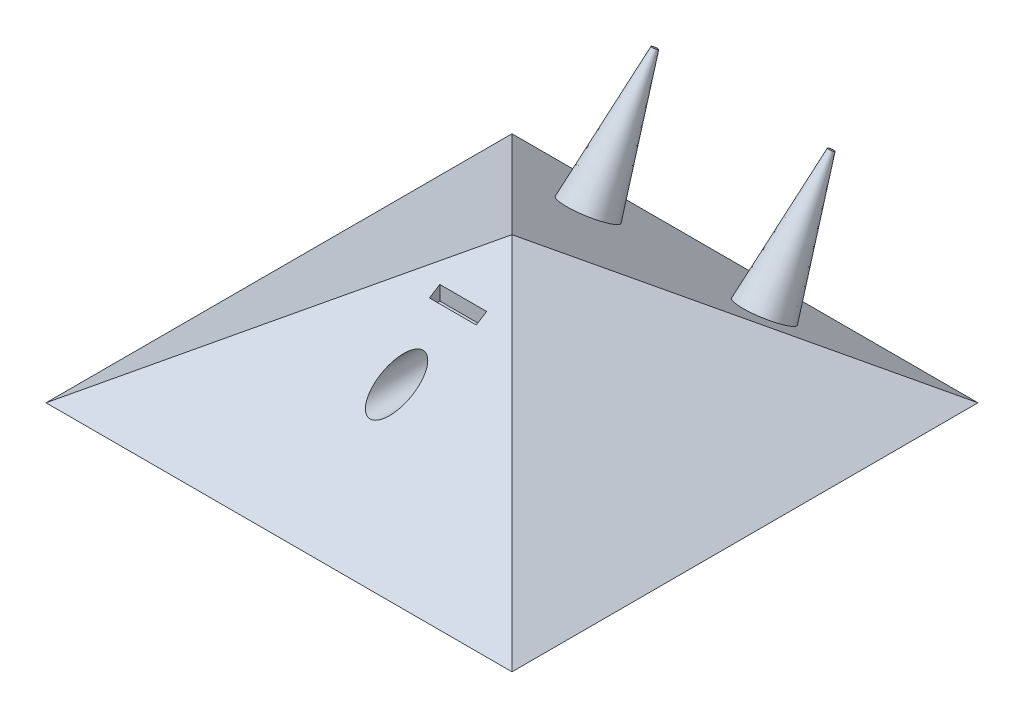
ISO-10303-21;
HEADER;
FILE_DESCRIPTION(('STEP AP214'),'2;1');
FILE_NAME('part.step','',(''),(''),'','','');
FILE_SCHEMA(('AUTOMOTIVE_DESIGN { 1 0 10303 214 1 1 1 1 }'));
ENDSEC;
DATA;
#1=APPLICATION_CONTEXT('core data for automotive mechanical design processes');
#2=APPLICATION_PROTOCOL_DEFINITION('international standard','automotive_design',2000,#1);
#3=PRODUCT_CONTEXT('',#1,'mechanical');
#4=PRODUCT('Part','Part','',(#3));
#5=PRODUCT_RELATED_PRODUCT_CATEGORY('part','',(#4));
#6=PRODUCT_DEFINITION_FORMATION('','',#4);
#7=PRODUCT_DEFINITION_CONTEXT('part definition',#1,'design');
#8=PRODUCT_DEFINITION('design','',#6,#7);
#9=PRODUCT_DEFINITION_SHAPE('','',#8);
#10=(LENGTH_UNIT() NAMED_UNIT(*) SI_UNIT(.MILLI.,.METRE.));
#11=(NAMED_UNIT(*) PLANE_ANGLE_UNIT() SI_UNIT($,.RADIAN.));
#12=(NAMED_UNIT(*) SI_UNIT($,.STERADIAN.) SOLID_ANGLE_UNIT());
#13=UNCERTAINTY_MEASURE_WITH_UNIT(LENGTH_MEASURE(1.E-05),#10,'distance_accuracy_value','');
#14=(GEOMETRIC_REPRESENTATION_CONTEXT(3) GLOBAL_UNCERTAINTY_ASSIGNED_CONTEXT((#13)) GLOBAL_UNIT_ASSIGNED_CONTEXT((#10,
#11,#12)) REPRESENTATION_CONTEXT('',''));
#15=CARTESIAN_POINT('',(0.,0.,0.));
#16=DIRECTION('',(0.,0.,1.));
#17=DIRECTION('',(1.,0.,0.));
#18=AXIS2_PLACEMENT_3D('',#15,#16,#17);
#19=CARTESIAN_POINT('',(-23.495,0.,-23.495));
#20=DIRECTION('',(0.,0.848048096156427,-0.529919264233203));
#21=DIRECTION('',(0.,0.529919264233203,0.848048096156427));
#22=AXIS2_PLACEMENT_3D('',#19,#20,#21);
#23=PLANE('',#22);
#24=CARTESIAN_POINT('',(9.43263957281454,4.66713960000683,-16.0260153462542));
#25=DIRECTION('',(0.,0.848048096156427,-0.529919264233203));
#26=DIRECTION('',(0.,0.529919264233203,0.848048096156427));
#27=AXIS2_PLACEMENT_3D('',#24,#25,#26);
#28=CIRCLE('',#27,2.54);
#29=CARTESIAN_POINT('',(9.43263957281454,6.01313453115917,-13.8719731820169));
#30=VERTEX_POINT('',#29);
#31=EDGE_CURVE('E141',#30,#30,#28,.T.);
#32=ORIENTED_EDGE('',*,*,#31,.F.);
#33=EDGE_LOOP('',(#32));
#34=FACE_BOUND('',#33,.T.);
#35=DIRECTION('',(-1.,0.,0.));
#36=VECTOR('',#35,1.);
#37=CARTESIAN_POINT('',(-23.495,0.,-23.495));
#38=LINE('',#37,#36);
#39=CARTESIAN_POINT('',(23.495,0.,-23.495));
#40=VERTEX_POINT('',#39);
#41=CARTESIAN_POINT('',(-23.495,0.,-23.495));
#42=VERTEX_POINT('',#41);
#43=EDGE_CURVE('E130',#40,#42,#38,.T.);
#44=ORIENTED_EDGE('',*,*,#43,.T.);
#45=DIRECTION('',(-0.646783756612922,-0.404155346820195,-0.646783756612922));
#46=VECTOR('',#45,1.);
#47=CARTESIAN_POINT('',(-3.83770958481696,12.2832383220288,-3.83770958481696));
#48=LINE('',#47,#46);
#49=CARTESIAN_POINT('',(0.,14.6813054231096,0.));
#50=VERTEX_POINT('',#49);
#51=EDGE_CURVE('E54',#50,#42,#48,.T.);
#52=ORIENTED_EDGE('',*,*,#51,.F.);
#53=DIRECTION('',(0.646783756612922,-0.404155346820195,-0.646783756612922));
#54=VECTOR('',#53,1.);
#55=CARTESIAN_POINT('',(3.83770958481695,12.2832383220288,-3.83770958481696));
#56=LINE('',#55,#54);
#57=EDGE_CURVE('E139',#50,#40,#56,.T.);
#58=ORIENTED_EDGE('',*,*,#57,.T.);
#59=EDGE_LOOP('',(#44,#52,#58));
#60=FACE_BOUND('',#59,.T.);
#61=CARTESIAN_POINT('',(-8.34736042718546,4.66713960000683,-16.0260153462542));
#62=DIRECTION('',(0.,0.848048096156427,-0.529919264233203));
#63=DIRECTION('',(0.,0.529919264233203,0.848048096156427));
#64=AXIS2_PLACEMENT_3D('',#61,#62,#63);
#65=CIRCLE('',#64,2.54);
#66=CARTESIAN_POINT('',(-8.34736042718546,6.01313453115917,-13.8719731820169));
#67=VERTEX_POINT('',#66);
#68=EDGE_CURVE('E148',#67,#67,#65,.T.);
#69=ORIENTED_EDGE('',*,*,#68,.F.);
#70=EDGE_LOOP('',(#69));
#71=FACE_BOUND('',#70,.T.);
#72=ADVANCED_FACE('F32',(#34,#60,#71),#23,.T.);
#73=CARTESIAN_POINT('',(23.495,0.,23.495));
#74=DIRECTION('',(0.529919264233203,0.848048096156427,0.));
#75=DIRECTION('',(-0.848048096156427,0.529919264233203,0.));
#76=AXIS2_PLACEMENT_3D('',#73,#74,#75);
#77=PLANE('',#76);
#78=DIRECTION('',(0.,0.,-1.));
#79=VECTOR('',#78,1.);
#80=CARTESIAN_POINT('',(23.495,0.,23.495));
#81=LINE('',#80,#79);
#82=CARTESIAN_POINT('',(23.495,0.,23.495));
#83=VERTEX_POINT('',#82);
#84=EDGE_CURVE('E127',#83,#40,#81,.T.);
#85=ORIENTED_EDGE('',*,*,#84,.T.);
#86=ORIENTED_EDGE('',*,*,#57,.F.);
#87=DIRECTION('',(0.646783756612922,-0.404155346820195,0.646783756612922));
#88=VECTOR('',#87,1.);
#89=CARTESIAN_POINT('',(23.495,0.,23.495));
#90=LINE('',#89,#88);
#91=EDGE_CURVE('E138',#50,#83,#90,.T.);
#92=ORIENTED_EDGE('',*,*,#91,.T.);
#93=EDGE_LOOP('',(#85,#86,#92));
#94=FACE_BOUND('',#93,.T.);
#95=ADVANCED_FACE('F174',(#94),#77,.T.);
#96=CARTESIAN_POINT('',(-23.495,0.,23.495));
#97=DIRECTION('',(-0.529919264233203,0.848048096156427,0.));
#98=DIRECTION('',(-0.848048096156427,-0.529919264233203,0.));
#99=AXIS2_PLACEMENT_3D('',#96,#97,#98);
#100=PLANE('',#99);
#101=DIRECTION('',(0.,0.,1.));
#102=VECTOR('',#101,1.);
#103=CARTESIAN_POINT('',(-23.495,0.,23.495));
#104=LINE('',#103,#102);
#105=CARTESIAN_POINT('',(-23.495,0.,23.495));
#106=VERTEX_POINT('',#105);
#107=EDGE_CURVE('E132',#42,#106,#104,.T.);
#108=ORIENTED_EDGE('',*,*,#107,.T.);
#109=DIRECTION('',(-0.646783756612922,-0.404155346820195,0.646783756612922));
#110=VECTOR('',#109,1.);
#111=CARTESIAN_POINT('',(-23.495,0.,23.495));
#112=LINE('',#111,#110);
#113=EDGE_CURVE('E143',#50,#106,#112,.T.);
#114=ORIENTED_EDGE('',*,*,#113,.F.);
#115=ORIENTED_EDGE('',*,*,#51,.T.);
#116=EDGE_LOOP('',(#108,#114,#115));
#117=FACE_BOUND('',#116,.T.);
#118=ADVANCED_FACE('F179',(#117),#100,.T.);
#119=CARTESIAN_POINT('',(-23.495,0.,23.495));
#120=DIRECTION('',(0.,0.848048096156427,0.529919264233203));
#121=DIRECTION('',(0.,-0.529919264233203,0.848048096156427));
#122=AXIS2_PLACEMENT_3D('',#119,#120,#121);
#123=PLANE('',#122);
#124=DIRECTION('',(-1.,0.,0.));
#125=VECTOR('',#124,1.);
#126=CARTESIAN_POINT('',(-23.495,11.6103817428291,4.91450520160276));
#127=LINE('',#126,#125);
#128=CARTESIAN_POINT('',(-2.36014350375294,11.6103817428291,4.91450520160276));
#129=VERTEX_POINT('',#128);
#130=CARTESIAN_POINT('',(2.36014350375294,11.6103817428291,4.91450520160276));
#131=VERTEX_POINT('',#130);
#132=EDGE_CURVE('E151',#129,#131,#127,.F.);
#133=ORIENTED_EDGE('',*,*,#132,.T.);
#134=DIRECTION('',(0.,0.529919264233203,-0.848048096156427));
#135=VECTOR('',#134,1.);
#136=CARTESIAN_POINT('',(2.36014350375294,0.,23.495));
#137=LINE('',#136,#135);
#138=CARTESIAN_POINT('',(2.36014350375294,10.9549233687832,5.96345786993739));
#139=VERTEX_POINT('',#138);
#140=EDGE_CURVE('E11',#131,#139,#137,.F.);
#141=ORIENTED_EDGE('',*,*,#140,.T.);
#142=DIRECTION('',(1.,0.,0.));
#143=VECTOR('',#142,1.);
#144=CARTESIAN_POINT('',(-23.495,10.9549233687832,5.96345786993739));
#145=LINE('',#144,#143);
#146=CARTESIAN_POINT('',(-2.36014350375294,10.9549233687832,5.96345786993739));
#147=VERTEX_POINT('',#146);
#148=EDGE_CURVE('E39',#139,#147,#145,.F.);
#149=ORIENTED_EDGE('',*,*,#148,.T.);
#150=DIRECTION('',(0.,-0.529919264233203,0.848048096156427));
#151=VECTOR('',#150,1.);
#152=CARTESIAN_POINT('',(-2.36014350375294,0.,23.495));
#153=LINE('',#152,#151);
#154=EDGE_CURVE('E155',#147,#129,#153,.F.);
#155=ORIENTED_EDGE('',*,*,#154,.T.);
#156=EDGE_LOOP('',(#133,#141,#149,#155));
#157=FACE_BOUND('',#156,.T.);
#158=CARTESIAN_POINT('',(0.,7.40791,11.6398658389715));
#159=DIRECTION('',(0.,0.848048096156427,0.529919264233203));
#160=DIRECTION('',(0.,-0.529919264233203,0.848048096156427));
#161=AXIS2_PLACEMENT_3D('',#158,#159,#160);
#162=ELLIPSE('',#161,3.14552633298203,1.666875);
#163=CARTESIAN_POINT('',(0.,5.741035,14.3074234570668));
#164=VERTEX_POINT('',#163);
#165=EDGE_CURVE('E120',#164,#164,#162,.F.);
#166=ORIENTED_EDGE('',*,*,#165,.T.);
#167=EDGE_LOOP('',(#166));
#168=FACE_BOUND('',#167,.T.);
#169=DIRECTION('',(1.,0.,0.));
#170=VECTOR('',#169,1.);
#171=CARTESIAN_POINT('',(-23.495,0.,23.495));
#172=LINE('',#171,#170);
#173=EDGE_CURVE('E135',#106,#83,#172,.T.);
#174=ORIENTED_EDGE('',*,*,#173,.T.);
#175=ORIENTED_EDGE('',*,*,#91,.F.);
#176=ORIENTED_EDGE('',*,*,#113,.T.);
#177=EDGE_LOOP('',(#174,#175,#176));
#178=FACE_BOUND('',#177,.T.);
#179=ADVANCED_FACE('F159',(#157,#168,#178),#123,.T.);
#180=CARTESIAN_POINT('',(0.,0.,0.));
#181=DIRECTION('',(0.,-1.,0.));
#182=DIRECTION('',(0.,0.,-1.));
#183=AXIS2_PLACEMENT_3D('',#180,#181,#182);
#184=PLANE('',#183);
#185=ORIENTED_EDGE('',*,*,#84,.F.);
#186=ORIENTED_EDGE('',*,*,#173,.F.);
#187=ORIENTED_EDGE('',*,*,#107,.F.);
#188=ORIENTED_EDGE('',*,*,#43,.F.);
#189=EDGE_LOOP('',(#185,#186,#187,#188));
#190=FACE_BOUND('',#189,.T.);
#191=ADVANCED_FACE('F208',(#190),#184,.T.);
#192=CARTESIAN_POINT('',(9.43263957281454,4.66713960000683,-16.0260153462542));
#193=DIRECTION('',(0.,-0.848048096156427,0.529919264233203));
#194=DIRECTION('',(0.,0.529919264233203,0.848048096156427));
#195=AXIS2_PLACEMENT_3D('',#192,#193,#194);
#196=CONICAL_SURFACE('',#195,2.54,0.174532925199433);
#197=CARTESIAN_POINT('',(9.43263957281454,15.4373504211935,-22.7559900020159));
#198=DIRECTION('',(0.,0.848048096156427,-0.529919264233203));
#199=DIRECTION('',(0.,0.529919264233203,0.848048096156427));
#200=AXIS2_PLACEMENT_3D('',#197,#198,#199);
#201=CIRCLE('',#200,0.300647345002491);
#202=CARTESIAN_POINT('',(9.43263957281454,15.5966692410508,-22.501026593472));
#203=VERTEX_POINT('',#202);
#204=EDGE_CURVE('E124',#203,#203,#201,.T.);
#205=CARTESIAN_POINT('',(9.43263957281454,15.5966692410508,-22.501026593472));
#206=CARTESIAN_POINT('',(9.43263957281454,15.4968407544895,-22.411140620436));
#207=CARTESIAN_POINT('',(9.43263957281454,15.3970122679281,-22.3212546474001));
#208=CARTESIAN_POINT('',(9.43263957281454,15.1973552948054,-22.1414827013281));
#209=CARTESIAN_POINT('',(9.43263957281454,15.097526808244,-22.0515967282921));
#210=CARTESIAN_POINT('',(9.43263957281454,14.8978698351212,-21.8718247822201));
#211=CARTESIAN_POINT('',(9.43263957281454,14.7980413485599,-21.7819388091841));
#212=CARTESIAN_POINT('',(9.43263957281454,14.5983843754371,-21.6021668631121));
#213=CARTESIAN_POINT('',(9.43263957281454,14.4985558888758,-21.5122808900761));
#214=CARTESIAN_POINT('',(9.43263957281454,14.298898915753,-21.3325089440042));
#215=CARTESIAN_POINT('',(9.43263957281454,14.1990704291916,-21.2426229709682));
#216=CARTESIAN_POINT('',(9.43263957281454,13.9994134560689,-21.0628510248962));
#217=CARTESIAN_POINT('',(9.43263957281454,13.8995849695075,-20.9729650518602));
#218=CARTESIAN_POINT('',(9.43263957281454,13.6999279963848,-20.7931931057882));
#219=CARTESIAN_POINT('',(9.43263957281454,13.6000995098234,-20.7033071327522));
#220=CARTESIAN_POINT('',(9.43263957281454,13.4004425367007,-20.5235351866802));
#221=CARTESIAN_POINT('',(9.43263957281454,13.3006140501393,-20.4336492136442));
#222=CARTESIAN_POINT('',(9.43263957281454,13.1009570770166,-20.2538772675723));
#223=CARTESIAN_POINT('',(9.43263957281454,13.0011285904552,-20.1639912945363));
#224=CARTESIAN_POINT('',(9.43263957281454,12.8014716173324,-19.9842193484643));
#225=CARTESIAN_POINT('',(9.43263957281454,12.7016431307711,-19.8943333754283));
#226=CARTESIAN_POINT('',(9.43263957281454,12.5019861576483,-19.7145614293563));
#227=CARTESIAN_POINT('',(9.43263957281454,12.402157671087,-19.6246754563203));
#228=CARTESIAN_POINT('',(9.43263957281454,12.2025006979642,-19.4449035102483));
#229=CARTESIAN_POINT('',(9.43263957281454,12.1026722114028,-19.3550175372123));
#230=CARTESIAN_POINT('',(9.43263957281454,11.9030152382801,-19.1752455911404));
#231=CARTESIAN_POINT('',(9.43263957281454,11.8031867517187,-19.0853596181044));
#232=CARTESIAN_POINT('',(9.43263957281454,11.603529778596,-18.9055876720324));
#233=CARTESIAN_POINT('',(9.43263957281454,11.5037012920346,-18.8157016989964));
#234=CARTESIAN_POINT('',(9.43263957281454,11.3040443189119,-18.6359297529244));
#235=CARTESIAN_POINT('',(9.43263957281454,11.2042158323505,-18.5460437798884));
#236=CARTESIAN_POINT('',(9.43263957281454,11.0045588592277,-18.3662718338164));
#237=CARTESIAN_POINT('',(9.43263957281454,10.9047303726664,-18.2763858607804));
#238=CARTESIAN_POINT('',(9.43263957281454,10.7050733995436,-18.0966139147085));
#239=CARTESIAN_POINT('',(9.43263957281454,10.6052449129823,-18.0067279416725));
#240=CARTESIAN_POINT('',(9.43263957281454,10.4055879398595,-17.8269559956005));
#241=CARTESIAN_POINT('',(9.43263957281454,10.3057594532981,-17.7370700225645));
#242=CARTESIAN_POINT('',(9.43263957281454,10.1061024801754,-17.5572980764925));
#243=CARTESIAN_POINT('',(9.43263957281454,10.006273993614,-17.4674121034565));
#244=CARTESIAN_POINT('',(9.43263957281454,9.80661702049129,-17.2876401573845));
#245=CARTESIAN_POINT('',(9.43263957281454,9.70678853392991,-17.1977541843486));
#246=CARTESIAN_POINT('',(9.43263957281454,9.50713156080717,-17.0179822382766));
#247=CARTESIAN_POINT('',(9.43263957281454,9.4073030742458,-16.9280962652406));
#248=CARTESIAN_POINT('',(9.43263957281454,9.20764610112306,-16.7483243191686));
#249=CARTESIAN_POINT('',(9.43263957281454,9.10781761456169,-16.6584383461326));
#250=CARTESIAN_POINT('',(9.43263957281454,8.90816064143894,-16.4786664000606));
#251=CARTESIAN_POINT('',(9.43263957281454,8.80833215487757,-16.3887804270246));
#252=CARTESIAN_POINT('',(9.43263957281454,8.60867518175483,-16.2090084809526));
#253=CARTESIAN_POINT('',(9.43263957281454,8.50884669519346,-16.1191225079167));
#254=CARTESIAN_POINT('',(9.43263957281454,8.30918972207071,-15.9393505618447));
#255=CARTESIAN_POINT('',(9.43263957281454,8.20936123550934,-15.8494645888087));
#256=CARTESIAN_POINT('',(9.43263957281454,8.0097042623866,-15.6696926427367));
#257=CARTESIAN_POINT('',(9.43263957281454,7.90987577582523,-15.5798066697007));
#258=CARTESIAN_POINT('',(9.43263957281454,7.71021880270248,-15.4000347236287));
#259=CARTESIAN_POINT('',(9.43263957281454,7.61039031614111,-15.3101487505927));
#260=CARTESIAN_POINT('',(9.43263957281454,7.41073334301837,-15.1303768045207));
#261=CARTESIAN_POINT('',(9.43263957281454,7.310904856457,-15.0404908314848));
#262=CARTESIAN_POINT('',(9.43263957281454,7.11124788333425,-14.8607188854128));
#263=CARTESIAN_POINT('',(9.43263957281454,7.01141939677288,-14.7708329123768));
#264=CARTESIAN_POINT('',(9.43263957281454,6.81176242365014,-14.5910609663048));
#265=CARTESIAN_POINT('',(9.43263957281454,6.71193393708877,-14.5011749932688));
#266=CARTESIAN_POINT('',(9.43263957281454,6.51227696396602,-14.3214030471968));
#267=CARTESIAN_POINT('',(9.43263957281454,6.41244847740465,-14.2315170741608));
#268=CARTESIAN_POINT('',(9.43263957281454,6.21279150428191,-14.0517451280889));
#269=CARTESIAN_POINT('',(9.43263957281454,6.11296301772054,-13.9618591550529));
#270=CARTESIAN_POINT('',(9.43263957281454,6.01313453115917,-13.8719731820169));
#271=B_SPLINE_CURVE_WITH_KNOTS('',3,(#205,#206,#207,#208,#209,#210,#211,#212,#213,#214,#215,
#216,#217,#218,#219,#220,#221,#222,#223,#224,#225,#226,#227,#228,#229,#230,#231,#232,#233,#234,
#235,#236,#237,#238,#239,#240,#241,#242,#243,#244,#245,#246,#247,#248,#249,#250,#251,#252,#253,
#254,#255,#256,#257,#258,#259,#260,#261,#262,#263,#264,#265,#266,#267,#268,#269,#270),
.UNSPECIFIED.,.F.,.F.,(4,2,2,2,2,2,2,2,2,2,2,2,2,2,2,2,2,2,2,2,2,2,2,2,2,2,2,2,2,2,2,2,4),(0.,
0.402997436592158,0.805994873184314,1.20899230977647,1.61198974636862,2.01498718296078,
2.41798461955294,2.82098205614509,3.22397949273725,3.6269769293294,4.02997436592155,
4.43297180251371,4.83596923910587,5.23896667569802,5.64196411229017,6.04496154888233,
6.44795898547449,6.85095642206664,7.25395385865879,7.65695129525095,8.05994873184311,
8.46294616843526,8.86594360502742,9.26894104161957,9.67193847821173,10.0749359148039,
10.477933351396,10.8809307879882,11.2839282245803,11.6869256611725,12.0899230977647,
12.4929205343568,12.895917970949),.UNSPECIFIED.);
#272=EDGE_CURVE('BSEAM200',#203,#30,#271,.T.);
#273=ORIENTED_EDGE('',*,*,#204,.F.);
#274=ORIENTED_EDGE('',*,*,#31,.T.);
#275=ORIENTED_EDGE('',*,*,#272,.T.);
#276=ORIENTED_EDGE('',*,*,#272,.F.);
#277=EDGE_LOOP('',(#273,#275,#274,#276));
#278=FACE_BOUND('',#277,.T.);
#279=ADVANCED_FACE('F200',(#278),#196,.T.);
#280=CARTESIAN_POINT('',(9.43263957281454,15.4373504211935,-22.7559900020159));
#281=DIRECTION('',(0.,0.848048096156427,-0.529919264233203));
#282=DIRECTION('',(0.,0.529919264233203,0.848048096156427));
#283=AXIS2_PLACEMENT_3D('',#280,#281,#282);
#284=PLANE('',#283);
#285=ORIENTED_EDGE('',*,*,#204,.T.);
#286=EDGE_LOOP('',(#285));
#287=FACE_BOUND('',#286,.T.);
#288=ADVANCED_FACE('F190',(#287),#284,.T.);
#289=CARTESIAN_POINT('',(-8.34736042718546,4.66713960000683,-16.0260153462542));
#290=DIRECTION('',(0.,-0.848048096156427,0.529919264233203));
#291=DIRECTION('',(0.,0.529919264233203,0.848048096156427));
#292=AXIS2_PLACEMENT_3D('',#289,#290,#291);
#293=CONICAL_SURFACE('',#292,2.54,0.174532925199433);
#294=CARTESIAN_POINT('',(-8.34736042718546,15.4373504211935,-22.7559900020159));
#295=DIRECTION('',(0.,0.848048096156427,-0.529919264233203));
#296=DIRECTION('',(0.,0.529919264233203,0.848048096156427));
#297=AXIS2_PLACEMENT_3D('',#294,#295,#296);
#298=CIRCLE('',#297,0.300647345002491);
#299=CARTESIAN_POINT('',(-8.34736042718546,15.5966692410508,-22.501026593472));
#300=VERTEX_POINT('',#299);
#301=EDGE_CURVE('E121',#300,#300,#298,.T.);
#302=CARTESIAN_POINT('',(-8.34736042718546,15.5966692410508,-22.501026593472));
#303=CARTESIAN_POINT('',(-8.34736042718546,15.4968407544895,-22.411140620436));
#304=CARTESIAN_POINT('',(-8.34736042718546,15.3970122679281,-22.3212546474001));
#305=CARTESIAN_POINT('',(-8.34736042718546,15.1973552948054,-22.1414827013281));
#306=CARTESIAN_POINT('',(-8.34736042718546,15.097526808244,-22.0515967282921));
#307=CARTESIAN_POINT('',(-8.34736042718546,14.8978698351212,-21.8718247822201));
#308=CARTESIAN_POINT('',(-8.34736042718546,14.7980413485599,-21.7819388091841));
#309=CARTESIAN_POINT('',(-8.34736042718546,14.5983843754371,-21.6021668631121));
#310=CARTESIAN_POINT('',(-8.34736042718546,14.4985558888758,-21.5122808900761));
#311=CARTESIAN_POINT('',(-8.34736042718546,14.298898915753,-21.3325089440042));
#312=CARTESIAN_POINT('',(-8.34736042718546,14.1990704291916,-21.2426229709682));
#313=CARTESIAN_POINT('',(-8.34736042718546,13.9994134560689,-21.0628510248962));
#314=CARTESIAN_POINT('',(-8.34736042718546,13.8995849695075,-20.9729650518602));
#315=CARTESIAN_POINT('',(-8.34736042718546,13.6999279963848,-20.7931931057882));
#316=CARTESIAN_POINT('',(-8.34736042718546,13.6000995098234,-20.7033071327522));
#317=CARTESIAN_POINT('',(-8.34736042718546,13.4004425367007,-20.5235351866802));
#318=CARTESIAN_POINT('',(-8.34736042718546,13.3006140501393,-20.4336492136442));
#319=CARTESIAN_POINT('',(-8.34736042718546,13.1009570770166,-20.2538772675723));
#320=CARTESIAN_POINT('',(-8.34736042718546,13.0011285904552,-20.1639912945363));
#321=CARTESIAN_POINT('',(-8.34736042718546,12.8014716173324,-19.9842193484643));
#322=CARTESIAN_POINT('',(-8.34736042718546,12.7016431307711,-19.8943333754283));
#323=CARTESIAN_POINT('',(-8.34736042718546,12.5019861576483,-19.7145614293563));
#324=CARTESIAN_POINT('',(-8.34736042718546,12.402157671087,-19.6246754563203));
#325=CARTESIAN_POINT('',(-8.34736042718546,12.2025006979642,-19.4449035102483));
#326=CARTESIAN_POINT('',(-8.34736042718546,12.1026722114028,-19.3550175372123));
#327=CARTESIAN_POINT('',(-8.34736042718546,11.9030152382801,-19.1752455911404));
#328=CARTESIAN_POINT('',(-8.34736042718546,11.8031867517187,-19.0853596181044));
#329=CARTESIAN_POINT('',(-8.34736042718546,11.603529778596,-18.9055876720324));
#330=CARTESIAN_POINT('',(-8.34736042718546,11.5037012920346,-18.8157016989964));
#331=CARTESIAN_POINT('',(-8.34736042718546,11.3040443189119,-18.6359297529244));
#332=CARTESIAN_POINT('',(-8.34736042718546,11.2042158323505,-18.5460437798884));
#333=CARTESIAN_POINT('',(-8.34736042718546,11.0045588592277,-18.3662718338164));
#334=CARTESIAN_POINT('',(-8.34736042718546,10.9047303726664,-18.2763858607804));
#335=CARTESIAN_POINT('',(-8.34736042718546,10.7050733995436,-18.0966139147085));
#336=CARTESIAN_POINT('',(-8.34736042718546,10.6052449129823,-18.0067279416725));
#337=CARTESIAN_POINT('',(-8.34736042718546,10.4055879398595,-17.8269559956005));
#338=CARTESIAN_POINT('',(-8.34736042718546,10.3057594532981,-17.7370700225645));
#339=CARTESIAN_POINT('',(-8.34736042718546,10.1061024801754,-17.5572980764925));
#340=CARTESIAN_POINT('',(-8.34736042718546,10.006273993614,-17.4674121034565));
#341=CARTESIAN_POINT('',(-8.34736042718546,9.80661702049129,-17.2876401573845));
#342=CARTESIAN_POINT('',(-8.34736042718546,9.70678853392991,-17.1977541843486));
#343=CARTESIAN_POINT('',(-8.34736042718546,9.50713156080717,-17.0179822382766));
#344=CARTESIAN_POINT('',(-8.34736042718546,9.4073030742458,-16.9280962652406));
#345=CARTESIAN_POINT('',(-8.34736042718546,9.20764610112306,-16.7483243191686));
#346=CARTESIAN_POINT('',(-8.34736042718546,9.10781761456169,-16.6584383461326));
#347=CARTESIAN_POINT('',(-8.34736042718546,8.90816064143894,-16.4786664000606));
#348=CARTESIAN_POINT('',(-8.34736042718546,8.80833215487757,-16.3887804270246));
#349=CARTESIAN_POINT('',(-8.34736042718546,8.60867518175483,-16.2090084809526));
#350=CARTESIAN_POINT('',(-8.34736042718546,8.50884669519346,-16.1191225079167));
#351=CARTESIAN_POINT('',(-8.34736042718546,8.30918972207071,-15.9393505618447));
#352=CARTESIAN_POINT('',(-8.34736042718546,8.20936123550934,-15.8494645888087));
#353=CARTESIAN_POINT('',(-8.34736042718546,8.0097042623866,-15.6696926427367));
#354=CARTESIAN_POINT('',(-8.34736042718546,7.90987577582523,-15.5798066697007));
#355=CARTESIAN_POINT('',(-8.34736042718546,7.71021880270248,-15.4000347236287));
#356=CARTESIAN_POINT('',(-8.34736042718546,7.61039031614111,-15.3101487505927));
#357=CARTESIAN_POINT('',(-8.34736042718546,7.41073334301837,-15.1303768045207));
#358=CARTESIAN_POINT('',(-8.34736042718546,7.310904856457,-15.0404908314848));
#359=CARTESIAN_POINT('',(-8.34736042718546,7.11124788333425,-14.8607188854128));
#360=CARTESIAN_POINT('',(-8.34736042718546,7.01141939677288,-14.7708329123768));
#361=CARTESIAN_POINT('',(-8.34736042718546,6.81176242365014,-14.5910609663048));
#362=CARTESIAN_POINT('',(-8.34736042718546,6.71193393708877,-14.5011749932688));
#363=CARTESIAN_POINT('',(-8.34736042718546,6.51227696396602,-14.3214030471968));
#364=CARTESIAN_POINT('',(-8.34736042718546,6.41244847740465,-14.2315170741608));
#365=CARTESIAN_POINT('',(-8.34736042718546,6.21279150428191,-14.0517451280889));
#366=CARTESIAN_POINT('',(-8.34736042718546,6.11296301772054,-13.9618591550529));
#367=CARTESIAN_POINT('',(-8.34736042718546,6.01313453115917,-13.8719731820169));
#368=B_SPLINE_CURVE_WITH_KNOTS('',3,(#302,#303,#304,#305,#306,#307,#308,#309,#310,#311,#312,
#313,#314,#315,#316,#317,#318,#319,#320,#321,#322,#323,#324,#325,#326,#327,#328,#329,#330,#331,
#332,#333,#334,#335,#336,#337,#338,#339,#340,#341,#342,#343,#344,#345,#346,#347,#348,#349,#350,
#351,#352,#353,#354,#355,#356,#357,#358,#359,#360,#361,#362,#363,#364,#365,#366,#367),
.UNSPECIFIED.,.F.,.F.,(4,2,2,2,2,2,2,2,2,2,2,2,2,2,2,2,2,2,2,2,2,2,2,2,2,2,2,2,2,2,2,2,4),(0.,
0.402997436592158,0.805994873184314,1.20899230977647,1.61198974636862,2.01498718296078,
2.41798461955294,2.82098205614509,3.22397949273725,3.6269769293294,4.02997436592155,
4.43297180251371,4.83596923910587,5.23896667569802,5.64196411229017,6.04496154888233,
6.44795898547449,6.85095642206664,7.25395385865879,7.65695129525095,8.05994873184311,
8.46294616843526,8.86594360502742,9.26894104161957,9.67193847821173,10.0749359148039,
10.477933351396,10.8809307879882,11.2839282245803,11.6869256611725,12.0899230977647,
12.4929205343568,12.895917970949),.UNSPECIFIED.);
#369=EDGE_CURVE('BSEAM187',#300,#67,#368,.T.);
#370=ORIENTED_EDGE('',*,*,#301,.F.);
#371=ORIENTED_EDGE('',*,*,#68,.T.);
#372=ORIENTED_EDGE('',*,*,#369,.T.);
#373=ORIENTED_EDGE('',*,*,#369,.F.);
#374=EDGE_LOOP('',(#370,#372,#371,#373));
#375=FACE_BOUND('',#374,.T.);
#376=ADVANCED_FACE('F187',(#375),#293,.T.);
#377=CARTESIAN_POINT('',(-8.34736042718546,15.4373504211935,-22.7559900020159));
#378=DIRECTION('',(0.,0.848048096156427,-0.529919264233203));
#379=DIRECTION('',(0.,0.529919264233203,0.848048096156427));
#380=AXIS2_PLACEMENT_3D('',#377,#378,#379);
#381=PLANE('',#380);
#382=ORIENTED_EDGE('',*,*,#301,.T.);
#383=EDGE_LOOP('',(#382));
#384=FACE_BOUND('',#383,.T.);
#385=ADVANCED_FACE('F189',(#384),#381,.T.);
#386=CARTESIAN_POINT('',(0.,7.40791,6.35));
#387=DIRECTION('',(0.,0.,1.));
#388=DIRECTION('',(1.,0.,0.));
#389=AXIS2_PLACEMENT_3D('',#386,#387,#388);
#390=CYLINDRICAL_SURFACE('',#389,1.666875);
#391=CARTESIAN_POINT('',(0.,7.40791,6.35));
#392=DIRECTION('',(0.,0.,1.));
#393=DIRECTION('',(1.,0.,0.));
#394=AXIS2_PLACEMENT_3D('',#391,#392,#393);
#395=CIRCLE('',#394,1.666875);
#396=CARTESIAN_POINT('',(1.666875,7.40791,6.35));
#397=VERTEX_POINT('',#396);
#398=EDGE_CURVE('E113',#397,#397,#395,.T.);
#399=ORIENTED_EDGE('',*,*,#398,.F.);
#400=EDGE_LOOP('',(#399));
#401=FACE_BOUND('',#400,.T.);
#402=ORIENTED_EDGE('',*,*,#165,.F.);
#403=EDGE_LOOP('',(#402));
#404=FACE_BOUND('',#403,.T.);
#405=ADVANCED_FACE('F197',(#401,#404),#390,.F.);
#406=CARTESIAN_POINT('',(0.,0.,6.35));
#407=DIRECTION('',(0.,0.,1.));
#408=DIRECTION('',(1.,0.,0.));
#409=AXIS2_PLACEMENT_3D('',#406,#407,#408);
#410=PLANE('',#409);
#411=ORIENTED_EDGE('',*,*,#398,.T.);
#412=EDGE_LOOP('',(#411));
#413=FACE_BOUND('',#412,.T.);
#414=ADVANCED_FACE('F261',(#413),#410,.T.);
#415=CARTESIAN_POINT('',(2.36014350375294,10.16,4.91450520160276));
#416=DIRECTION('',(1.,0.,0.));
#417=DIRECTION('',(0.,0.,-1.));
#418=AXIS2_PLACEMENT_3D('',#415,#416,#417);
#419=PLANE('',#418);
#420=DIRECTION('',(0.,1.,0.));
#421=VECTOR('',#420,1.);
#422=CARTESIAN_POINT('',(2.36014350375294,10.16,4.91450520160276));
#423=LINE('',#422,#421);
#424=CARTESIAN_POINT('',(2.36014350375294,10.16,4.91450520160276));
#425=VERTEX_POINT('',#424);
#426=EDGE_CURVE('E46',#425,#131,#423,.T.);
#427=ORIENTED_EDGE('',*,*,#426,.F.);
#428=DIRECTION('',(0.,0.,-1.));
#429=VECTOR('',#428,1.);
#430=CARTESIAN_POINT('',(2.36014350375294,10.16,4.91450520160276));
#431=LINE('',#430,#429);
#432=CARTESIAN_POINT('',(2.36014350375294,10.16,5.96345786993739));
#433=VERTEX_POINT('',#432);
#434=EDGE_CURVE('E90',#433,#425,#431,.T.);
#435=ORIENTED_EDGE('',*,*,#434,.F.);
#436=DIRECTION('',(0.,1.,0.));
#437=VECTOR('',#436,1.);
#438=CARTESIAN_POINT('',(2.36014350375294,10.16,5.96345786993739));
#439=LINE('',#438,#437);
#440=EDGE_CURVE('E111',#433,#139,#439,.T.);
#441=ORIENTED_EDGE('',*,*,#440,.T.);
#442=ORIENTED_EDGE('',*,*,#140,.F.);
#443=EDGE_LOOP('',(#427,#435,#441,#442));
#444=FACE_BOUND('',#443,.T.);
#445=ADVANCED_FACE('F87',(#444),#419,.F.);
#446=CARTESIAN_POINT('',(-2.36014350375294,10.16,5.96345786993739));
#447=DIRECTION('',(0.,0.,1.));
#448=DIRECTION('',(1.,0.,0.));
#449=AXIS2_PLACEMENT_3D('',#446,#447,#448);
#450=PLANE('',#449);
#451=ORIENTED_EDGE('',*,*,#440,.F.);
#452=DIRECTION('',(1.,0.,0.));
#453=VECTOR('',#452,1.);
#454=CARTESIAN_POINT('',(-2.36014350375294,10.16,5.96345786993739));
#455=LINE('',#454,#453);
#456=CARTESIAN_POINT('',(-2.36014350375294,10.16,5.96345786993739));
#457=VERTEX_POINT('',#456);
#458=EDGE_CURVE('E94',#457,#433,#455,.T.);
#459=ORIENTED_EDGE('',*,*,#458,.F.);
#460=DIRECTION('',(0.,1.,0.));
#461=VECTOR('',#460,1.);
#462=CARTESIAN_POINT('',(-2.36014350375294,10.16,5.96345786993739));
#463=LINE('',#462,#461);
#464=EDGE_CURVE('E114',#457,#147,#463,.T.);
#465=ORIENTED_EDGE('',*,*,#464,.T.);
#466=ORIENTED_EDGE('',*,*,#148,.F.);
#467=EDGE_LOOP('',(#451,#459,#465,#466));
#468=FACE_BOUND('',#467,.T.);
#469=ADVANCED_FACE('F162',(#468),#450,.F.);
#470=CARTESIAN_POINT('',(-2.36014350375294,10.16,4.91450520160276));
#471=DIRECTION('',(-1.,0.,0.));
#472=DIRECTION('',(0.,0.,1.));
#473=AXIS2_PLACEMENT_3D('',#470,#471,#472);
#474=PLANE('',#473);
#475=ORIENTED_EDGE('',*,*,#464,.F.);
#476=DIRECTION('',(0.,0.,1.));
#477=VECTOR('',#476,1.);
#478=CARTESIAN_POINT('',(-2.36014350375294,10.16,4.91450520160276));
#479=LINE('',#478,#477);
#480=CARTESIAN_POINT('',(-2.36014350375294,10.16,4.91450520160276));
#481=VERTEX_POINT('',#480);
#482=EDGE_CURVE('E103',#481,#457,#479,.T.);
#483=ORIENTED_EDGE('',*,*,#482,.F.);
#484=DIRECTION('',(0.,1.,0.));
#485=VECTOR('',#484,1.);
#486=CARTESIAN_POINT('',(-2.36014350375294,10.16,4.91450520160276));
#487=LINE('',#486,#485);
#488=EDGE_CURVE('E93',#481,#129,#487,.T.);
#489=ORIENTED_EDGE('',*,*,#488,.T.);
#490=ORIENTED_EDGE('',*,*,#154,.F.);
#491=EDGE_LOOP('',(#475,#483,#489,#490));
#492=FACE_BOUND('',#491,.T.);
#493=ADVANCED_FACE('F164',(#492),#474,.F.);
#494=CARTESIAN_POINT('',(-2.36014350375294,10.16,4.91450520160276));
#495=DIRECTION('',(0.,0.,-1.));
#496=DIRECTION('',(-1.,0.,0.));
#497=AXIS2_PLACEMENT_3D('',#494,#495,#496);
#498=PLANE('',#497);
#499=ORIENTED_EDGE('',*,*,#488,.F.);
#500=DIRECTION('',(-1.,0.,0.));
#501=VECTOR('',#500,1.);
#502=CARTESIAN_POINT('',(-2.36014350375294,10.16,4.91450520160276));
#503=LINE('',#502,#501);
#504=EDGE_CURVE('E97',#425,#481,#503,.T.);
#505=ORIENTED_EDGE('',*,*,#504,.F.);
#506=ORIENTED_EDGE('',*,*,#426,.T.);
#507=ORIENTED_EDGE('',*,*,#132,.F.);
#508=EDGE_LOOP('',(#499,#505,#506,#507));
#509=FACE_BOUND('',#508,.T.);
#510=ADVANCED_FACE('F98',(#509),#498,.F.);
#511=CARTESIAN_POINT('',(0.,10.16,0.));
#512=DIRECTION('',(0.,1.,0.));
#513=DIRECTION('',(0.,0.,1.));
#514=AXIS2_PLACEMENT_3D('',#511,#512,#513);
#515=PLANE('',#514);
#516=ORIENTED_EDGE('',*,*,#434,.T.);
#517=ORIENTED_EDGE('',*,*,#504,.T.);
#518=ORIENTED_EDGE('',*,*,#482,.T.);
#519=ORIENTED_EDGE('',*,*,#458,.T.);
#520=EDGE_LOOP('',(#516,#517,#518,#519));
#521=FACE_BOUND('',#520,.T.);
#522=ADVANCED_FACE('F105',(#521),#515,.T.);
#523=CLOSED_SHELL('',(#72,#95,#118,#179,#191,#279,#288,#376,#385,#405,#414,#445,#469,#493,#510,#522));
#524=MANIFOLD_SOLID_BREP('B2',#523);
#525=ADVANCED_BREP_SHAPE_REPRESENTATION('',(#18,#524),#14);
#526=SHAPE_DEFINITION_REPRESENTATION(#9,#525);
ENDSEC;
END-ISO-10303-21;
